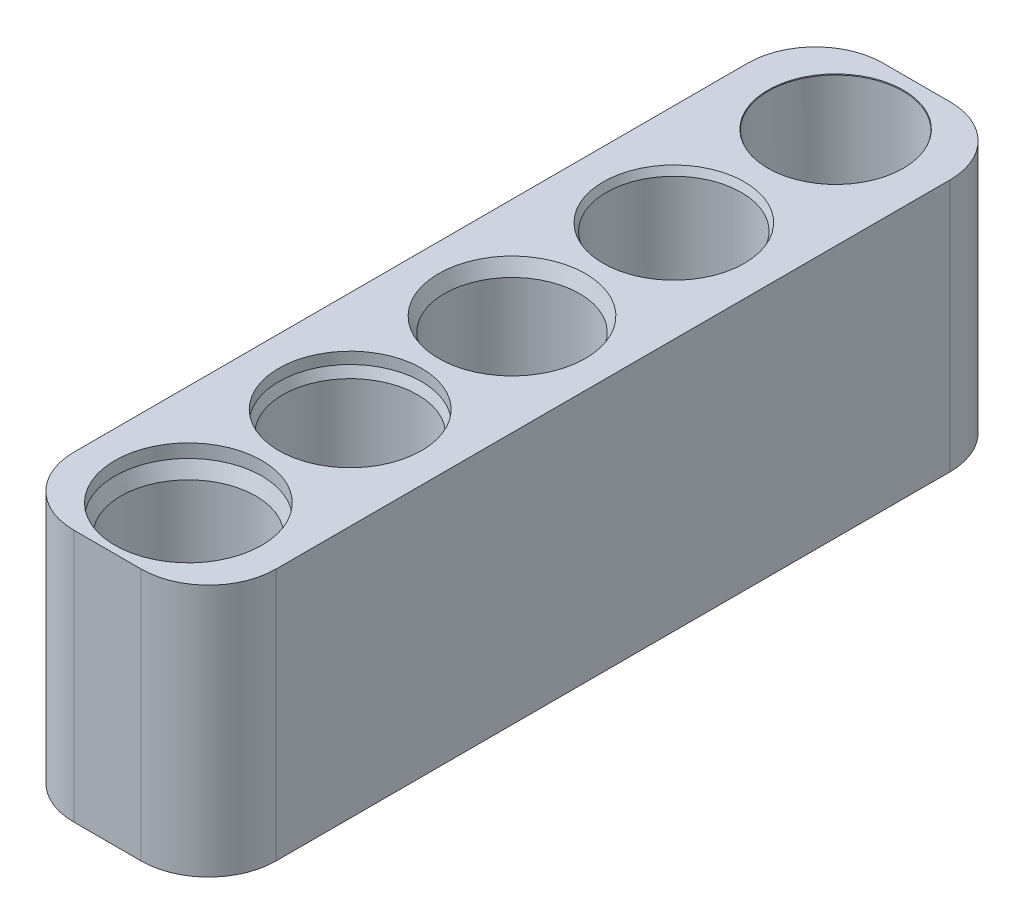
ISO-10303-21;
HEADER;
FILE_DESCRIPTION(('STEP AP214'),'2;1');
FILE_NAME('part.step','',(''),(''),'','','');
FILE_SCHEMA(('AUTOMOTIVE_DESIGN { 1 0 10303 214 1 1 1 1 }'));
ENDSEC;
DATA;
#1=APPLICATION_CONTEXT('core data for automotive mechanical design processes');
#2=APPLICATION_PROTOCOL_DEFINITION('international standard','automotive_design',2000,#1);
#3=PRODUCT_CONTEXT('',#1,'mechanical');
#4=PRODUCT('Part','Part','',(#3));
#5=PRODUCT_RELATED_PRODUCT_CATEGORY('part','',(#4));
#6=PRODUCT_DEFINITION_FORMATION('','',#4);
#7=PRODUCT_DEFINITION_CONTEXT('part definition',#1,'design');
#8=PRODUCT_DEFINITION('design','',#6,#7);
#9=PRODUCT_DEFINITION_SHAPE('','',#8);
#10=(LENGTH_UNIT() NAMED_UNIT(*) SI_UNIT(.MILLI.,.METRE.));
#11=(NAMED_UNIT(*) PLANE_ANGLE_UNIT() SI_UNIT($,.RADIAN.));
#12=(NAMED_UNIT(*) SI_UNIT($,.STERADIAN.) SOLID_ANGLE_UNIT());
#13=UNCERTAINTY_MEASURE_WITH_UNIT(LENGTH_MEASURE(1.E-05),#10,'distance_accuracy_value','');
#14=(GEOMETRIC_REPRESENTATION_CONTEXT(3) GLOBAL_UNCERTAINTY_ASSIGNED_CONTEXT((#13)) GLOBAL_UNIT_ASSIGNED_CONTEXT((#10,
#11,#12)) REPRESENTATION_CONTEXT('',''));
#15=CARTESIAN_POINT('',(0.,0.,0.));
#16=DIRECTION('',(0.,0.,1.));
#17=DIRECTION('',(1.,0.,0.));
#18=AXIS2_PLACEMENT_3D('',#15,#16,#17);
#19=CARTESIAN_POINT('',(-15.,3.,60.));
#20=DIRECTION('',(1.,0.,0.));
#21=DIRECTION('',(0.,1.,0.));
#22=AXIS2_PLACEMENT_3D('',#19,#20,#21);
#23=PLANE('',#22);
#24=DIRECTION('',(0.,0.,-1.));
#25=VECTOR('',#24,1.);
#26=CARTESIAN_POINT('',(-15.,3.,60.));
#27=LINE('',#26,#25);
#28=CARTESIAN_POINT('',(-15.,3.,50.));
#29=VERTEX_POINT('',#28);
#30=CARTESIAN_POINT('',(-15.,3.,-50.));
#31=VERTEX_POINT('',#30);
#32=EDGE_CURVE('E151',#29,#31,#27,.T.);
#33=ORIENTED_EDGE('',*,*,#32,.F.);
#34=DIRECTION('',(0.,-1.,0.));
#35=VECTOR('',#34,1.);
#36=CARTESIAN_POINT('',(-15.,3.,50.));
#37=LINE('',#36,#35);
#38=CARTESIAN_POINT('',(-15.,40.5,50.));
#39=VERTEX_POINT('',#38);
#40=EDGE_CURVE('E113',#29,#39,#37,.F.);
#41=ORIENTED_EDGE('',*,*,#40,.T.);
#42=DIRECTION('',(0.,0.,-1.));
#43=VECTOR('',#42,1.);
#44=CARTESIAN_POINT('',(-15.,40.5,60.));
#45=LINE('',#44,#43);
#46=CARTESIAN_POINT('',(-15.,40.5,-50.));
#47=VERTEX_POINT('',#46);
#48=EDGE_CURVE('E138',#39,#47,#45,.T.);
#49=ORIENTED_EDGE('',*,*,#48,.T.);
#50=DIRECTION('',(0.,-1.,0.));
#51=VECTOR('',#50,1.);
#52=CARTESIAN_POINT('',(-15.,3.,-50.));
#53=LINE('',#52,#51);
#54=EDGE_CURVE('E118',#47,#31,#53,.T.);
#55=ORIENTED_EDGE('',*,*,#54,.T.);
#56=EDGE_LOOP('',(#33,#41,#49,#55));
#57=FACE_BOUND('',#56,.T.);
#58=ADVANCED_FACE('F42',(#57),#23,.F.);
#59=CARTESIAN_POINT('',(-15.,3.,60.));
#60=DIRECTION('',(0.,1.,0.));
#61=DIRECTION('',(-1.,0.,0.));
#62=AXIS2_PLACEMENT_3D('',#59,#60,#61);
#63=PLANE('',#62);
#64=CARTESIAN_POINT('',(0.,3.,48.));
#65=DIRECTION('',(0.,1.,0.));
#66=DIRECTION('',(-1.,0.,0.));
#67=AXIS2_PLACEMENT_3D('',#64,#65,#66);
#68=CIRCLE('',#67,4.16347172712618);
#69=CARTESIAN_POINT('',(-4.16347172712618,3.,48.));
#70=VERTEX_POINT('',#69);
#71=EDGE_CURVE('E178',#70,#70,#68,.T.);
#72=ORIENTED_EDGE('',*,*,#71,.T.);
#73=EDGE_LOOP('',(#72));
#74=FACE_BOUND('',#73,.T.);
#75=CARTESIAN_POINT('',(0.,3.,-24.));
#76=DIRECTION('',(0.,1.,0.));
#77=DIRECTION('',(-1.,0.,0.));
#78=AXIS2_PLACEMENT_3D('',#75,#76,#77);
#79=CIRCLE('',#78,1.66666666666667);
#80=CARTESIAN_POINT('',(0.,3.,-22.3333333333333));
#81=VERTEX_POINT('',#80);
#82=EDGE_CURVE('E175',#81,#81,#79,.T.);
#83=ORIENTED_EDGE('',*,*,#82,.T.);
#84=EDGE_LOOP('',(#83));
#85=FACE_BOUND('',#84,.T.);
#86=CARTESIAN_POINT('',(0.,3.,-48.));
#87=DIRECTION('',(0.,1.,0.));
#88=DIRECTION('',(-1.,0.,0.));
#89=AXIS2_PLACEMENT_3D('',#86,#87,#88);
#90=CIRCLE('',#89,0.833333333333333);
#91=CARTESIAN_POINT('',(0.,3.,-47.1666666666667));
#92=VERTEX_POINT('',#91);
#93=EDGE_CURVE('E172',#92,#92,#90,.T.);
#94=ORIENTED_EDGE('',*,*,#93,.T.);
#95=EDGE_LOOP('',(#94));
#96=FACE_BOUND('',#95,.T.);
#97=CARTESIAN_POINT('',(0.,3.,24.));
#98=DIRECTION('',(0.,1.,0.));
#99=DIRECTION('',(-1.,0.,0.));
#100=AXIS2_PLACEMENT_3D('',#97,#98,#99);
#101=CIRCLE('',#100,3.33173586356309);
#102=CARTESIAN_POINT('',(0.,3.,27.3317358635631));
#103=VERTEX_POINT('',#102);
#104=EDGE_CURVE('E169',#103,#103,#101,.T.);
#105=ORIENTED_EDGE('',*,*,#104,.T.);
#106=EDGE_LOOP('',(#105));
#107=FACE_BOUND('',#106,.T.);
#108=CARTESIAN_POINT('',(0.,3.,0.));
#109=DIRECTION('',(0.,1.,0.));
#110=DIRECTION('',(-1.,0.,0.));
#111=AXIS2_PLACEMENT_3D('',#108,#109,#110);
#112=CIRCLE('',#111,2.5);
#113=CARTESIAN_POINT('',(0.,3.,2.5));
#114=VERTEX_POINT('',#113);
#115=EDGE_CURVE('E166',#114,#114,#112,.T.);
#116=ORIENTED_EDGE('',*,*,#115,.T.);
#117=EDGE_LOOP('',(#116));
#118=FACE_BOUND('',#117,.T.);
#119=DIRECTION('',(1.,0.,0.));
#120=VECTOR('',#119,1.);
#121=CARTESIAN_POINT('',(-15.,3.,60.));
#122=LINE('',#121,#120);
#123=CARTESIAN_POINT('',(-4.99999999999999,3.,60.));
#124=VERTEX_POINT('',#123);
#125=CARTESIAN_POINT('',(5.,3.,60.));
#126=VERTEX_POINT('',#125);
#127=EDGE_CURVE('E126',#124,#126,#122,.T.);
#128=ORIENTED_EDGE('',*,*,#127,.F.);
#129=CARTESIAN_POINT('',(-4.99999999999999,3.,50.));
#130=DIRECTION('',(0.,1.,0.));
#131=DIRECTION('',(-1.,0.,0.));
#132=AXIS2_PLACEMENT_3D('',#129,#130,#131);
#133=CIRCLE('',#132,10.);
#134=EDGE_CURVE('E108',#124,#29,#133,.F.);
#135=ORIENTED_EDGE('',*,*,#134,.T.);
#136=ORIENTED_EDGE('',*,*,#32,.T.);
#137=CARTESIAN_POINT('',(-4.99999999999999,3.,-50.));
#138=DIRECTION('',(0.,1.,0.));
#139=DIRECTION('',(-1.,0.,0.));
#140=AXIS2_PLACEMENT_3D('',#137,#138,#139);
#141=CIRCLE('',#140,10.);
#142=CARTESIAN_POINT('',(-4.99999999999999,3.,-60.));
#143=VERTEX_POINT('',#142);
#144=EDGE_CURVE('E119',#31,#143,#141,.F.);
#145=ORIENTED_EDGE('',*,*,#144,.T.);
#146=DIRECTION('',(1.,0.,0.));
#147=VECTOR('',#146,1.);
#148=CARTESIAN_POINT('',(-15.,3.,-60.));
#149=LINE('',#148,#147);
#150=CARTESIAN_POINT('',(5.,3.,-60.));
#151=VERTEX_POINT('',#150);
#152=EDGE_CURVE('E140',#143,#151,#149,.T.);
#153=ORIENTED_EDGE('',*,*,#152,.T.);
#154=CARTESIAN_POINT('',(5.,3.,-50.));
#155=DIRECTION('',(0.,1.,0.));
#156=DIRECTION('',(-1.,0.,0.));
#157=AXIS2_PLACEMENT_3D('',#154,#155,#156);
#158=CIRCLE('',#157,10.);
#159=CARTESIAN_POINT('',(15.,3.,-50.));
#160=VERTEX_POINT('',#159);
#161=EDGE_CURVE('E183',#151,#160,#158,.F.);
#162=ORIENTED_EDGE('',*,*,#161,.T.);
#163=DIRECTION('',(0.,0.,-1.));
#164=VECTOR('',#163,1.);
#165=CARTESIAN_POINT('',(15.,3.,60.));
#166=LINE('',#165,#164);
#167=CARTESIAN_POINT('',(15.,3.,50.));
#168=VERTEX_POINT('',#167);
#169=EDGE_CURVE('E148',#168,#160,#166,.T.);
#170=ORIENTED_EDGE('',*,*,#169,.F.);
#171=CARTESIAN_POINT('',(5.,3.,50.));
#172=DIRECTION('',(0.,1.,0.));
#173=DIRECTION('',(-1.,0.,0.));
#174=AXIS2_PLACEMENT_3D('',#171,#172,#173);
#175=CIRCLE('',#174,10.);
#176=EDGE_CURVE('E130',#168,#126,#175,.F.);
#177=ORIENTED_EDGE('',*,*,#176,.T.);
#178=EDGE_LOOP('',(#128,#135,#136,#145,#153,#162,#170,#177));
#179=FACE_BOUND('',#178,.T.);
#180=ADVANCED_FACE('F133',(#74,#85,#96,#107,#118,#179),#63,.F.);
#181=CARTESIAN_POINT('',(15.,3.,60.));
#182=DIRECTION('',(-1.,0.,0.));
#183=DIRECTION('',(0.,-1.,0.));
#184=AXIS2_PLACEMENT_3D('',#181,#182,#183);
#185=PLANE('',#184);
#186=ORIENTED_EDGE('',*,*,#169,.T.);
#187=DIRECTION('',(0.,1.,0.));
#188=VECTOR('',#187,1.);
#189=CARTESIAN_POINT('',(15.,40.5,-50.));
#190=LINE('',#189,#188);
#191=CARTESIAN_POINT('',(15.,40.5,-50.));
#192=VERTEX_POINT('',#191);
#193=EDGE_CURVE('E11',#160,#192,#190,.T.);
#194=ORIENTED_EDGE('',*,*,#193,.T.);
#195=DIRECTION('',(0.,0.,-1.));
#196=VECTOR('',#195,1.);
#197=CARTESIAN_POINT('',(15.,40.5,60.));
#198=LINE('',#197,#196);
#199=CARTESIAN_POINT('',(15.,40.5,50.));
#200=VERTEX_POINT('',#199);
#201=EDGE_CURVE('E146',#200,#192,#198,.T.);
#202=ORIENTED_EDGE('',*,*,#201,.F.);
#203=DIRECTION('',(0.,1.,0.));
#204=VECTOR('',#203,1.);
#205=CARTESIAN_POINT('',(15.,3.,50.));
#206=LINE('',#205,#204);
#207=EDGE_CURVE('E50',#200,#168,#206,.F.);
#208=ORIENTED_EDGE('',*,*,#207,.T.);
#209=EDGE_LOOP('',(#186,#194,#202,#208));
#210=FACE_BOUND('',#209,.T.);
#211=ADVANCED_FACE('F201',(#210),#185,.F.);
#212=CARTESIAN_POINT('',(-15.,40.5,60.));
#213=DIRECTION('',(0.,-1.,0.));
#214=DIRECTION('',(1.,0.,0.));
#215=AXIS2_PLACEMENT_3D('',#212,#213,#214);
#216=PLANE('',#215);
#217=CARTESIAN_POINT('',(0.,40.5,48.));
#218=DIRECTION('',(0.,-1.,0.));
#219=DIRECTION('',(1.,0.,0.));
#220=AXIS2_PLACEMENT_3D('',#217,#218,#219);
#221=CIRCLE('',#220,10.9);
#222=CARTESIAN_POINT('',(10.9,40.5,48.));
#223=VERTEX_POINT('',#222);
#224=EDGE_CURVE('E163',#223,#223,#221,.F.);
#225=ORIENTED_EDGE('',*,*,#224,.F.);
#226=EDGE_LOOP('',(#225));
#227=FACE_BOUND('',#226,.T.);
#228=CARTESIAN_POINT('',(0.,40.5,-24.));
#229=DIRECTION('',(0.,-1.,0.));
#230=DIRECTION('',(1.,0.,0.));
#231=AXIS2_PLACEMENT_3D('',#228,#229,#230);
#232=CIRCLE('',#231,10.4739130434783);
#233=CARTESIAN_POINT('',(10.4739130434783,40.5,-24.));
#234=VERTEX_POINT('',#233);
#235=EDGE_CURVE('E160',#234,#234,#232,.F.);
#236=ORIENTED_EDGE('',*,*,#235,.F.);
#237=EDGE_LOOP('',(#236));
#238=FACE_BOUND('',#237,.T.);
#239=CARTESIAN_POINT('',(0.,40.5,-48.));
#240=DIRECTION('',(0.,-1.,0.));
#241=DIRECTION('',(1.,0.,0.));
#242=AXIS2_PLACEMENT_3D('',#239,#240,#241);
#243=CIRCLE('',#242,10.0478260869565);
#244=CARTESIAN_POINT('',(10.0478260869565,40.5,-48.));
#245=VERTEX_POINT('',#244);
#246=EDGE_CURVE('E156',#245,#245,#243,.F.);
#247=ORIENTED_EDGE('',*,*,#246,.F.);
#248=EDGE_LOOP('',(#247));
#249=FACE_BOUND('',#248,.T.);
#250=CARTESIAN_POINT('',(0.,40.5,24.));
#251=DIRECTION('',(0.,-1.,0.));
#252=DIRECTION('',(1.,0.,0.));
#253=AXIS2_PLACEMENT_3D('',#250,#251,#252);
#254=CIRCLE('',#253,10.5926916677333);
#255=CARTESIAN_POINT('',(10.5926916677333,40.5,24.));
#256=VERTEX_POINT('',#255);
#257=EDGE_CURVE('E153',#256,#256,#254,.F.);
#258=ORIENTED_EDGE('',*,*,#257,.F.);
#259=EDGE_LOOP('',(#258));
#260=FACE_BOUND('',#259,.T.);
#261=CARTESIAN_POINT('',(0.,40.5,0.));
#262=DIRECTION('',(0.,-1.,0.));
#263=DIRECTION('',(0.,0.,-1.));
#264=AXIS2_PLACEMENT_3D('',#261,#262,#263);
#265=CIRCLE('',#264,10.9);
#266=CARTESIAN_POINT('',(0.,40.5,-10.9));
#267=VERTEX_POINT('',#266);
#268=EDGE_CURVE('E221',#267,#267,#265,.T.);
#269=ORIENTED_EDGE('',*,*,#268,.T.);
#270=EDGE_LOOP('',(#269));
#271=FACE_BOUND('',#270,.T.);
#272=ORIENTED_EDGE('',*,*,#48,.F.);
#273=CARTESIAN_POINT('',(-5.,40.5,50.));
#274=DIRECTION('',(0.,-1.,0.));
#275=DIRECTION('',(1.,0.,0.));
#276=AXIS2_PLACEMENT_3D('',#273,#274,#275);
#277=CIRCLE('',#276,10.);
#278=CARTESIAN_POINT('',(-5.,40.5,60.));
#279=VERTEX_POINT('',#278);
#280=EDGE_CURVE('E194',#39,#279,#277,.F.);
#281=ORIENTED_EDGE('',*,*,#280,.T.);
#282=DIRECTION('',(-1.,0.,0.));
#283=VECTOR('',#282,1.);
#284=CARTESIAN_POINT('',(-15.,40.5,60.));
#285=LINE('',#284,#283);
#286=CARTESIAN_POINT('',(5.00000000000001,40.5,60.));
#287=VERTEX_POINT('',#286);
#288=EDGE_CURVE('E129',#287,#279,#285,.T.);
#289=ORIENTED_EDGE('',*,*,#288,.F.);
#290=CARTESIAN_POINT('',(5.00000000000001,40.5,50.));
#291=DIRECTION('',(0.,-1.,0.));
#292=DIRECTION('',(1.,0.,0.));
#293=AXIS2_PLACEMENT_3D('',#290,#291,#292);
#294=CIRCLE('',#293,10.);
#295=EDGE_CURVE('E189',#287,#200,#294,.F.);
#296=ORIENTED_EDGE('',*,*,#295,.T.);
#297=ORIENTED_EDGE('',*,*,#201,.T.);
#298=CARTESIAN_POINT('',(5.00000000000001,40.5,-50.));
#299=DIRECTION('',(0.,-1.,0.));
#300=DIRECTION('',(1.,0.,0.));
#301=AXIS2_PLACEMENT_3D('',#298,#299,#300);
#302=CIRCLE('',#301,10.);
#303=CARTESIAN_POINT('',(5.00000000000001,40.5,-60.));
#304=VERTEX_POINT('',#303);
#305=EDGE_CURVE('E64',#192,#304,#302,.F.);
#306=ORIENTED_EDGE('',*,*,#305,.T.);
#307=DIRECTION('',(-1.,0.,0.));
#308=VECTOR('',#307,1.);
#309=CARTESIAN_POINT('',(-15.,40.5,-60.));
#310=LINE('',#309,#308);
#311=CARTESIAN_POINT('',(-5.,40.5,-60.));
#312=VERTEX_POINT('',#311);
#313=EDGE_CURVE('E136',#304,#312,#310,.T.);
#314=ORIENTED_EDGE('',*,*,#313,.T.);
#315=CARTESIAN_POINT('',(-5.,40.5,-50.));
#316=DIRECTION('',(0.,-1.,0.));
#317=DIRECTION('',(1.,0.,0.));
#318=AXIS2_PLACEMENT_3D('',#315,#316,#317);
#319=CIRCLE('',#318,10.);
#320=EDGE_CURVE('E192',#312,#47,#319,.F.);
#321=ORIENTED_EDGE('',*,*,#320,.T.);
#322=EDGE_LOOP('',(#272,#281,#289,#296,#297,#306,#314,#321));
#323=FACE_BOUND('',#322,.T.);
#324=ADVANCED_FACE('F207',(#227,#238,#249,#260,#271,#323),#216,.F.);
#325=CARTESIAN_POINT('',(0.,0.,60.));
#326=DIRECTION('',(0.,0.,-1.));
#327=DIRECTION('',(-1.,0.,0.));
#328=AXIS2_PLACEMENT_3D('',#325,#326,#327);
#329=PLANE('',#328);
#330=ORIENTED_EDGE('',*,*,#288,.T.);
#331=DIRECTION('',(0.,-1.,0.));
#332=VECTOR('',#331,1.);
#333=CARTESIAN_POINT('',(-4.99999999999999,0.,60.));
#334=LINE('',#333,#332);
#335=EDGE_CURVE('E112',#279,#124,#334,.T.);
#336=ORIENTED_EDGE('',*,*,#335,.T.);
#337=ORIENTED_EDGE('',*,*,#127,.T.);
#338=DIRECTION('',(0.,1.,0.));
#339=VECTOR('',#338,1.);
#340=CARTESIAN_POINT('',(5.,0.,60.));
#341=LINE('',#340,#339);
#342=EDGE_CURVE('E131',#126,#287,#341,.T.);
#343=ORIENTED_EDGE('',*,*,#342,.T.);
#344=EDGE_LOOP('',(#330,#336,#337,#343));
#345=FACE_BOUND('',#344,.T.);
#346=ADVANCED_FACE('F124',(#345),#329,.F.);
#347=CARTESIAN_POINT('',(0.,0.,-60.));
#348=DIRECTION('',(0.,0.,-1.));
#349=DIRECTION('',(-1.,0.,0.));
#350=AXIS2_PLACEMENT_3D('',#347,#348,#349);
#351=PLANE('',#350);
#352=ORIENTED_EDGE('',*,*,#152,.F.);
#353=DIRECTION('',(0.,-1.,0.));
#354=VECTOR('',#353,1.);
#355=CARTESIAN_POINT('',(-5.,40.5,-60.));
#356=LINE('',#355,#354);
#357=EDGE_CURVE('E57',#143,#312,#356,.F.);
#358=ORIENTED_EDGE('',*,*,#357,.T.);
#359=ORIENTED_EDGE('',*,*,#313,.F.);
#360=DIRECTION('',(0.,1.,0.));
#361=VECTOR('',#360,1.);
#362=CARTESIAN_POINT('',(5.,3.,-60.));
#363=LINE('',#362,#361);
#364=EDGE_CURVE('E196',#304,#151,#363,.F.);
#365=ORIENTED_EDGE('',*,*,#364,.T.);
#366=EDGE_LOOP('',(#352,#358,#359,#365));
#367=FACE_BOUND('',#366,.T.);
#368=ADVANCED_FACE('F213',(#367),#351,.T.);
#369=CARTESIAN_POINT('',(0.,0.,0.));
#370=DIRECTION('',(0.,1.,0.));
#371=DIRECTION('',(0.,0.,1.));
#372=AXIS2_PLACEMENT_3D('',#369,#370,#371);
#373=CONICAL_SURFACE('',#372,0.,0.694738276196703);
#374=CARTESIAN_POINT('',(0.,12.,0.));
#375=DIRECTION('',(0.,-1.,0.));
#376=DIRECTION('',(0.,0.,-1.));
#377=AXIS2_PLACEMENT_3D('',#374,#375,#376);
#378=CIRCLE('',#377,10.);
#379=CARTESIAN_POINT('',(0.,12.,10.));
#380=VERTEX_POINT('',#379);
#381=EDGE_CURVE('E157',#380,#380,#378,.T.);
#382=CARTESIAN_POINT('',(0.,12.,10.));
#383=CARTESIAN_POINT('',(0.,11.90625,9.921875));
#384=CARTESIAN_POINT('',(0.,11.8125,9.84375));
#385=CARTESIAN_POINT('',(0.,11.625,9.6875));
#386=CARTESIAN_POINT('',(0.,11.53125,9.609375));
#387=CARTESIAN_POINT('',(0.,11.34375,9.453125));
#388=CARTESIAN_POINT('',(0.,11.25,9.375));
#389=CARTESIAN_POINT('',(0.,11.0625,9.21875));
#390=CARTESIAN_POINT('',(0.,10.96875,9.140625));
#391=CARTESIAN_POINT('',(0.,10.78125,8.984375));
#392=CARTESIAN_POINT('',(0.,10.6875,8.90625));
#393=CARTESIAN_POINT('',(0.,10.5,8.75));
#394=CARTESIAN_POINT('',(0.,10.40625,8.671875));
#395=CARTESIAN_POINT('',(0.,10.21875,8.515625));
#396=CARTESIAN_POINT('',(0.,10.125,8.4375));
#397=CARTESIAN_POINT('',(0.,9.9375,8.28125));
#398=CARTESIAN_POINT('',(0.,9.84375,8.203125));
#399=CARTESIAN_POINT('',(0.,9.65625,8.046875));
#400=CARTESIAN_POINT('',(0.,9.5625,7.96875));
#401=CARTESIAN_POINT('',(0.,9.375,7.8125));
#402=CARTESIAN_POINT('',(0.,9.28125,7.734375));
#403=CARTESIAN_POINT('',(0.,9.09375,7.578125));
#404=CARTESIAN_POINT('',(0.,9.00000000000001,7.5));
#405=CARTESIAN_POINT('',(0.,8.8125,7.34375));
#406=CARTESIAN_POINT('',(0.,8.71875,7.265625));
#407=CARTESIAN_POINT('',(0.,8.53125,7.109375));
#408=CARTESIAN_POINT('',(0.,8.4375,7.03125));
#409=CARTESIAN_POINT('',(0.,8.25,6.875));
#410=CARTESIAN_POINT('',(0.,8.15625,6.796875));
#411=CARTESIAN_POINT('',(0.,7.96875,6.640625));
#412=CARTESIAN_POINT('',(0.,7.875,6.5625));
#413=CARTESIAN_POINT('',(0.,7.6875,6.40625));
#414=CARTESIAN_POINT('',(0.,7.59375,6.328125));
#415=CARTESIAN_POINT('',(0.,7.40625,6.171875));
#416=CARTESIAN_POINT('',(0.,7.3125,6.09375));
#417=CARTESIAN_POINT('',(0.,7.125,5.9375));
#418=CARTESIAN_POINT('',(0.,7.03125,5.859375));
#419=CARTESIAN_POINT('',(0.,6.84375,5.703125));
#420=CARTESIAN_POINT('',(0.,6.75,5.625));
#421=CARTESIAN_POINT('',(0.,6.5625,5.46875));
#422=CARTESIAN_POINT('',(0.,6.46875,5.390625));
#423=CARTESIAN_POINT('',(0.,6.28125,5.234375));
#424=CARTESIAN_POINT('',(0.,6.1875,5.15625));
#425=CARTESIAN_POINT('',(0.,6.,5.));
#426=CARTESIAN_POINT('',(0.,5.90625,4.921875));
#427=CARTESIAN_POINT('',(0.,5.71875,4.765625));
#428=CARTESIAN_POINT('',(0.,5.625,4.6875));
#429=CARTESIAN_POINT('',(0.,5.4375,4.53125));
#430=CARTESIAN_POINT('',(0.,5.34375,4.453125));
#431=CARTESIAN_POINT('',(0.,5.15625,4.296875));
#432=CARTESIAN_POINT('',(0.,5.0625,4.21875));
#433=CARTESIAN_POINT('',(0.,4.875,4.0625));
#434=CARTESIAN_POINT('',(0.,4.78125,3.984375));
#435=CARTESIAN_POINT('',(0.,4.59375,3.828125));
#436=CARTESIAN_POINT('',(0.,4.5,3.75));
#437=CARTESIAN_POINT('',(0.,4.3125,3.59375));
#438=CARTESIAN_POINT('',(0.,4.21875,3.515625));
#439=CARTESIAN_POINT('',(0.,4.03125,3.359375));
#440=CARTESIAN_POINT('',(0.,3.9375,3.28125));
#441=CARTESIAN_POINT('',(0.,3.75,3.125));
#442=CARTESIAN_POINT('',(0.,3.65625,3.046875));
#443=CARTESIAN_POINT('',(0.,3.46875,2.890625));
#444=CARTESIAN_POINT('',(0.,3.375,2.8125));
#445=CARTESIAN_POINT('',(0.,3.1875,2.65625));
#446=CARTESIAN_POINT('',(0.,3.09375,2.578125));
#447=CARTESIAN_POINT('',(0.,3.,2.5));
#448=B_SPLINE_CURVE_WITH_KNOTS('',3,(#382,#383,#384,#385,#386,#387,#388,#389,#390,#391,#392,
#393,#394,#395,#396,#397,#398,#399,#400,#401,#402,#403,#404,#405,#406,#407,#408,#409,#410,#411,
#412,#413,#414,#415,#416,#417,#418,#419,#420,#421,#422,#423,#424,#425,#426,#427,#428,#429,#430,
#431,#432,#433,#434,#435,#436,#437,#438,#439,#440,#441,#442,#443,#444,#445,#446,#447),
.UNSPECIFIED.,.F.,.F.,(4,2,2,2,2,2,2,2,2,2,2,2,2,2,2,2,2,2,2,2,2,2,2,2,2,2,2,2,2,2,2,2,4),(0.,
0.366105453558125,0.732210907116249,1.09831636067437,1.4644218142325,1.83052726779062,
2.19663272134875,2.56273817490687,2.928843628465,3.29494908202312,3.66105453558125,
4.02715998913937,4.39326544269749,4.75937089625562,5.12547634981374,5.49158180337187,
5.85768725692999,6.22379271048811,6.58989816404624,6.95600361760436,7.32210907116249,
7.68821452472061,8.05431997827873,8.42042543183686,8.78653088539498,9.15263633895311,
9.51874179251123,9.88484724606936,10.2509526996275,10.6170581531856,10.9831636067437,
11.3492690603019,11.71537451386),.UNSPECIFIED.);
#449=EDGE_CURVE('BSEAM280',#380,#114,#448,.T.);
#450=ORIENTED_EDGE('',*,*,#381,.F.);
#451=ORIENTED_EDGE('',*,*,#115,.F.);
#452=ORIENTED_EDGE('',*,*,#449,.T.);
#453=ORIENTED_EDGE('',*,*,#449,.F.);
#454=EDGE_LOOP('',(#450,#452,#451,#453));
#455=FACE_BOUND('',#454,.T.);
#456=ADVANCED_FACE('F280',(#455),#373,.F.);
#457=CARTESIAN_POINT('',(0.,0.,0.));
#458=DIRECTION('',(0.,-1.,0.));
#459=DIRECTION('',(0.,0.,-1.));
#460=AXIS2_PLACEMENT_3D('',#457,#458,#459);
#461=CYLINDRICAL_SURFACE('',#460,10.);
#462=CARTESIAN_POINT('',(0.,38.3877551020408,0.));
#463=DIRECTION('',(0.,-1.,0.));
#464=DIRECTION('',(0.,0.,-1.));
#465=AXIS2_PLACEMENT_3D('',#462,#463,#464);
#466=CIRCLE('',#465,10.);
#467=CARTESIAN_POINT('',(0.,38.3877551020408,-10.));
#468=VERTEX_POINT('',#467);
#469=EDGE_CURVE('E218',#468,#468,#466,.T.);
#470=ORIENTED_EDGE('',*,*,#469,.F.);
#471=EDGE_LOOP('',(#470));
#472=FACE_BOUND('',#471,.T.);
#473=ORIENTED_EDGE('',*,*,#381,.T.);
#474=EDGE_LOOP('',(#473));
#475=FACE_BOUND('',#474,.T.);
#476=ADVANCED_FACE('F282',(#472,#475),#461,.F.);
#477=CARTESIAN_POINT('',(0.,40.5,0.));
#478=DIRECTION('',(0.,1.,0.));
#479=DIRECTION('',(0.,0.,1.));
#480=AXIS2_PLACEMENT_3D('',#477,#478,#479);
#481=CONICAL_SURFACE('',#480,10.9,0.402790949039647);
#482=ORIENTED_EDGE('',*,*,#469,.T.);
#483=EDGE_LOOP('',(#482));
#484=FACE_BOUND('',#483,.T.);
#485=ORIENTED_EDGE('',*,*,#268,.F.);
#486=EDGE_LOOP('',(#485));
#487=FACE_BOUND('',#486,.T.);
#488=ADVANCED_FACE('F289',(#484,#487),#481,.F.);
#489=CARTESIAN_POINT('',(0.,-0.998083036275707,24.));
#490=DIRECTION('',(0.,1.,0.));
#491=DIRECTION('',(0.,0.,1.));
#492=AXIS2_PLACEMENT_3D('',#489,#490,#491);
#493=CONICAL_SURFACE('',#492,0.,0.694738276196703);
#494=CARTESIAN_POINT('',(0.,11.0019169637243,24.));
#495=DIRECTION('',(0.,-1.,0.));
#496=DIRECTION('',(0.,0.,-1.));
#497=AXIS2_PLACEMENT_3D('',#494,#495,#496);
#498=CIRCLE('',#497,10.);
#499=CARTESIAN_POINT('',(0.,11.0019169637243,34.));
#500=VERTEX_POINT('',#499);
#501=EDGE_CURVE('E240',#500,#500,#498,.T.);
#502=CARTESIAN_POINT('',(0.,11.0019169637243,34.));
#503=CARTESIAN_POINT('',(0.,10.9185636620188,33.9305389152454));
#504=CARTESIAN_POINT('',(0.,10.8352103603134,33.8610778304909));
#505=CARTESIAN_POINT('',(0.,10.6685037569025,33.7221556609818));
#506=CARTESIAN_POINT('',(0.,10.585150455197,33.6526945762272));
#507=CARTESIAN_POINT('',(0.,10.4184438517861,33.5137724067181));
#508=CARTESIAN_POINT('',(0.,10.3350905500806,33.4443113219636));
#509=CARTESIAN_POINT('',(0.,10.1683839466697,33.3053891524545));
#510=CARTESIAN_POINT('',(0.,10.0850306449642,33.2359280676999));
#511=CARTESIAN_POINT('',(0.,9.9183240415533,33.0970058981908));
#512=CARTESIAN_POINT('',(0.,9.83497073984784,33.0275448134363));
#513=CARTESIAN_POINT('',(0.,9.66826413643691,32.8886226439272));
#514=CARTESIAN_POINT('',(0.,9.58491083473145,32.8191615591726));
#515=CARTESIAN_POINT('',(0.,9.41820423132053,32.6802393896635));
#516=CARTESIAN_POINT('',(0.,9.33485092961507,32.610778304909));
#517=CARTESIAN_POINT('',(0.,9.16814432620415,32.4718561353999));
#518=CARTESIAN_POINT('',(0.,9.08479102449868,32.4023950506453));
#519=CARTESIAN_POINT('',(0.,8.91808442108776,32.2634728811362));
#520=CARTESIAN_POINT('',(0.,8.8347311193823,32.1940117963817));
#521=CARTESIAN_POINT('',(0.,8.66802451597138,32.0550896268726));
#522=CARTESIAN_POINT('',(0.,8.58467121426592,31.985628542118));
#523=CARTESIAN_POINT('',(0.,8.41796461085499,31.8467063726089));
#524=CARTESIAN_POINT('',(0.,8.33461130914953,31.7772452878544));
#525=CARTESIAN_POINT('',(0.,8.16790470573861,31.6383231183453));
#526=CARTESIAN_POINT('',(0.,8.08455140403315,31.5688620335907));
#527=CARTESIAN_POINT('',(0.,7.91784480062223,31.4299398640816));
#528=CARTESIAN_POINT('',(0.,7.83449149891676,31.3604787793271));
#529=CARTESIAN_POINT('',(0.,7.66778489550584,31.221556609818));
#530=CARTESIAN_POINT('',(0.,7.58443159380038,31.1520955250634));
#531=CARTESIAN_POINT('',(0.,7.41772499038946,31.0131733555543));
#532=CARTESIAN_POINT('',(0.,7.334371688684,30.9437122707998));
#533=CARTESIAN_POINT('',(0.,7.16766508527307,30.8047901012906));
#534=CARTESIAN_POINT('',(0.,7.08431178356761,30.7353290165361));
#535=CARTESIAN_POINT('',(0.,6.91760518015669,30.596406847027));
#536=CARTESIAN_POINT('',(0.,6.83425187845123,30.5269457622724));
#537=CARTESIAN_POINT('',(0.,6.6675452750403,30.3880235927633));
#538=CARTESIAN_POINT('',(0.,6.58419197333484,30.3185625080088));
#539=CARTESIAN_POINT('',(0.,6.41748536992392,30.1796403384997));
#540=CARTESIAN_POINT('',(0.,6.33413206821846,30.1101792537451));
#541=CARTESIAN_POINT('',(0.,6.16742546480754,29.971257084236));
#542=CARTESIAN_POINT('',(0.,6.08407216310207,29.9017959994815));
#543=CARTESIAN_POINT('',(0.,5.91736555969115,29.7628738299724));
#544=CARTESIAN_POINT('',(0.,5.83401225798569,29.6934127452178));
#545=CARTESIAN_POINT('',(0.,5.66730565457477,29.5544905757087));
#546=CARTESIAN_POINT('',(0.,5.58395235286931,29.4850294909542));
#547=CARTESIAN_POINT('',(0.,5.41724574945838,29.3461073214451));
#548=CARTESIAN_POINT('',(0.,5.33389244775292,29.2766462366905));
#549=CARTESIAN_POINT('',(0.,5.167185844342,29.1377240671814));
#550=CARTESIAN_POINT('',(0.,5.08383254263654,29.0682629824269));
#551=CARTESIAN_POINT('',(0.,4.91712593922561,28.9293408129178));
#552=CARTESIAN_POINT('',(0.,4.83377263752015,28.8598797281632));
#553=CARTESIAN_POINT('',(0.,4.66706603410923,28.7209575586541));
#554=CARTESIAN_POINT('',(0.,4.58371273240377,28.6514964738996));
#555=CARTESIAN_POINT('',(0.,4.41700612899285,28.5125743043905));
#556=CARTESIAN_POINT('',(0.,4.33365282728739,28.4431132196359));
#557=CARTESIAN_POINT('',(0.,4.16694622387646,28.3041910501268));
#558=CARTESIAN_POINT('',(0.,4.083592922171,28.2347299653723));
#559=CARTESIAN_POINT('',(0.,3.91688631876008,28.0958077958632));
#560=CARTESIAN_POINT('',(0.,3.83353301705462,28.0263467111086));
#561=CARTESIAN_POINT('',(0.,3.66682641364369,27.8874245415995));
#562=CARTESIAN_POINT('',(0.,3.58347311193823,27.817963456845));
#563=CARTESIAN_POINT('',(0.,3.41676650852731,27.6790412873358));
#564=CARTESIAN_POINT('',(0.,3.33341320682185,27.6095802025813));
#565=CARTESIAN_POINT('',(0.,3.16670660341093,27.4706580330722));
#566=CARTESIAN_POINT('',(0.,3.08335330170546,27.4011969483176));
#567=CARTESIAN_POINT('',(0.,3.,27.3317358635631));
#568=B_SPLINE_CURVE_WITH_KNOTS('',3,(#502,#503,#504,#505,#506,#507,#508,#509,#510,#511,#512,
#513,#514,#515,#516,#517,#518,#519,#520,#521,#522,#523,#524,#525,#526,#527,#528,#529,#530,#531,
#532,#533,#534,#535,#536,#537,#538,#539,#540,#541,#542,#543,#544,#545,#546,#547,#548,#549,#550,
#551,#552,#553,#554,#555,#556,#557,#558,#559,#560,#561,#562,#563,#564,#565,#566,#567),
.UNSPECIFIED.,.F.,.F.,(4,2,2,2,2,2,2,2,2,2,2,2,2,2,2,2,2,2,2,2,2,2,2,2,2,2,2,2,2,2,2,2,4),(0.,
0.325505048815418,0.651010097630831,0.976515146446245,1.30202019526166,1.62752524407708,
1.95303029289249,2.27853534170791,2.60404039052332,2.92954543933873,3.25505048815415,
3.58055553696956,3.90606058578498,4.23156563460039,4.55707068341581,4.88257573223122,
5.20808078104664,5.53358582986205,5.85909087867747,6.18459592749288,6.5101009763083,
6.83560602512371,7.16111107393912,7.48661612275454,7.81212117156996,8.13762622038537,
8.46313126920078,8.7886363180162,9.11414136683161,9.43964641564703,9.76515146446244,
10.0906565132779,10.4161615620933),.UNSPECIFIED.);
#569=EDGE_CURVE('BSEAM500',#500,#103,#568,.T.);
#570=ORIENTED_EDGE('',*,*,#501,.F.);
#571=ORIENTED_EDGE('',*,*,#104,.F.);
#572=ORIENTED_EDGE('',*,*,#569,.T.);
#573=ORIENTED_EDGE('',*,*,#569,.F.);
#574=EDGE_LOOP('',(#570,#572,#571,#573));
#575=FACE_BOUND('',#574,.T.);
#576=ADVANCED_FACE('F500',(#575),#493,.F.);
#577=CARTESIAN_POINT('',(0.,-0.998083036275707,24.));
#578=DIRECTION('',(0.,-1.,0.));
#579=DIRECTION('',(0.,0.,-1.));
#580=AXIS2_PLACEMENT_3D('',#577,#578,#579);
#581=CYLINDRICAL_SURFACE('',#580,10.5926916677333);
#582=CARTESIAN_POINT('',(0.,38.7806831226901,24.));
#583=DIRECTION('',(0.,-1.,0.));
#584=DIRECTION('',(0.,0.,-1.));
#585=AXIS2_PLACEMENT_3D('',#582,#583,#584);
#586=CIRCLE('',#585,10.5926916677333);
#587=CARTESIAN_POINT('',(0.,38.7806831226901,13.4073083322667));
#588=VERTEX_POINT('',#587);
#589=EDGE_CURVE('E247',#588,#588,#586,.T.);
#590=ORIENTED_EDGE('',*,*,#589,.T.);
#591=EDGE_LOOP('',(#590));
#592=FACE_BOUND('',#591,.T.);
#593=ORIENTED_EDGE('',*,*,#257,.T.);
#594=EDGE_LOOP('',(#593));
#595=FACE_BOUND('',#594,.T.);
#596=ADVANCED_FACE('F489',(#592,#595),#581,.F.);
#597=CARTESIAN_POINT('',(0.,-0.998083036275707,24.));
#598=DIRECTION('',(0.,-1.,0.));
#599=DIRECTION('',(0.,0.,-1.));
#600=AXIS2_PLACEMENT_3D('',#597,#598,#599);
#601=CYLINDRICAL_SURFACE('',#600,10.);
#602=CARTESIAN_POINT('',(0.,37.3896720657651,24.));
#603=DIRECTION('',(0.,-1.,0.));
#604=DIRECTION('',(0.,0.,-1.));
#605=AXIS2_PLACEMENT_3D('',#602,#603,#604);
#606=CIRCLE('',#605,10.);
#607=CARTESIAN_POINT('',(0.,37.3896720657651,14.));
#608=VERTEX_POINT('',#607);
#609=EDGE_CURVE('E244',#608,#608,#606,.T.);
#610=ORIENTED_EDGE('',*,*,#609,.F.);
#611=EDGE_LOOP('',(#610));
#612=FACE_BOUND('',#611,.T.);
#613=ORIENTED_EDGE('',*,*,#501,.T.);
#614=EDGE_LOOP('',(#613));
#615=FACE_BOUND('',#614,.T.);
#616=ADVANCED_FACE('F478',(#612,#615),#601,.F.);
#617=CARTESIAN_POINT('',(0.,38.7806831226901,24.));
#618=DIRECTION('',(0.,1.,0.));
#619=DIRECTION('',(0.,0.,1.));
#620=AXIS2_PLACEMENT_3D('',#617,#618,#619);
#621=CONICAL_SURFACE('',#620,10.5926916677333,0.402790949039647);
#622=ORIENTED_EDGE('',*,*,#609,.T.);
#623=EDGE_LOOP('',(#622));
#624=FACE_BOUND('',#623,.T.);
#625=ORIENTED_EDGE('',*,*,#589,.F.);
#626=EDGE_LOOP('',(#625));
#627=FACE_BOUND('',#626,.T.);
#628=ADVANCED_FACE('F268',(#624,#627),#621,.F.);
#629=CARTESIAN_POINT('',(0.,2.,-48.));
#630=DIRECTION('',(0.,1.,0.));
#631=DIRECTION('',(0.,0.,1.));
#632=AXIS2_PLACEMENT_3D('',#629,#630,#631);
#633=CONICAL_SURFACE('',#632,0.,0.694738276196703);
#634=CARTESIAN_POINT('',(0.,14.,-48.));
#635=DIRECTION('',(0.,-1.,0.));
#636=DIRECTION('',(0.,0.,-1.));
#637=AXIS2_PLACEMENT_3D('',#634,#635,#636);
#638=CIRCLE('',#637,9.99999999999999);
#639=CARTESIAN_POINT('',(0.,14.,-38.));
#640=VERTEX_POINT('',#639);
#641=EDGE_CURVE('E232',#640,#640,#638,.T.);
#642=CARTESIAN_POINT('',(0.,14.,-38.));
#643=CARTESIAN_POINT('',(0.,13.8854166666667,-38.0954861111111));
#644=CARTESIAN_POINT('',(0.,13.7708333333333,-38.1909722222222));
#645=CARTESIAN_POINT('',(0.,13.5416666666667,-38.3819444444445));
#646=CARTESIAN_POINT('',(0.,13.4270833333333,-38.4774305555556));
#647=CARTESIAN_POINT('',(0.,13.1979166666667,-38.6684027777778));
#648=CARTESIAN_POINT('',(0.,13.0833333333333,-38.7638888888889));
#649=CARTESIAN_POINT('',(0.,12.8541666666667,-38.9548611111111));
#650=CARTESIAN_POINT('',(0.,12.7395833333333,-39.0503472222222));
#651=CARTESIAN_POINT('',(0.,12.5104166666667,-39.2413194444444));
#652=CARTESIAN_POINT('',(0.,12.3958333333333,-39.3368055555556));
#653=CARTESIAN_POINT('',(0.,12.1666666666667,-39.5277777777778));
#654=CARTESIAN_POINT('',(0.,12.0520833333333,-39.6232638888889));
#655=CARTESIAN_POINT('',(0.,11.8229166666667,-39.8142361111111));
#656=CARTESIAN_POINT('',(0.,11.7083333333333,-39.9097222222222));
#657=CARTESIAN_POINT('',(0.,11.4791666666667,-40.1006944444444));
#658=CARTESIAN_POINT('',(0.,11.3645833333333,-40.1961805555556));
#659=CARTESIAN_POINT('',(0.,11.1354166666667,-40.3871527777778));
#660=CARTESIAN_POINT('',(0.,11.0208333333333,-40.4826388888889));
#661=CARTESIAN_POINT('',(0.,10.7916666666667,-40.6736111111111));
#662=CARTESIAN_POINT('',(0.,10.6770833333333,-40.7690972222222));
#663=CARTESIAN_POINT('',(0.,10.4479166666667,-40.9600694444445));
#664=CARTESIAN_POINT('',(0.,10.3333333333333,-41.0555555555556));
#665=CARTESIAN_POINT('',(0.,10.1041666666667,-41.2465277777778));
#666=CARTESIAN_POINT('',(0.,9.98958333333333,-41.3420138888889));
#667=CARTESIAN_POINT('',(0.,9.76041666666667,-41.5329861111111));
#668=CARTESIAN_POINT('',(0.,9.64583333333334,-41.6284722222222));
#669=CARTESIAN_POINT('',(0.,9.41666666666667,-41.8194444444444));
#670=CARTESIAN_POINT('',(0.,9.30208333333333,-41.9149305555556));
#671=CARTESIAN_POINT('',(0.,9.07291666666667,-42.1059027777778));
#672=CARTESIAN_POINT('',(0.,8.95833333333334,-42.2013888888889));
#673=CARTESIAN_POINT('',(0.,8.72916666666667,-42.3923611111111));
#674=CARTESIAN_POINT('',(0.,8.61458333333333,-42.4878472222222));
#675=CARTESIAN_POINT('',(0.,8.38541666666667,-42.6788194444444));
#676=CARTESIAN_POINT('',(0.,8.27083333333333,-42.7743055555556));
#677=CARTESIAN_POINT('',(0.,8.04166666666667,-42.9652777777778));
#678=CARTESIAN_POINT('',(0.,7.92708333333333,-43.0607638888889));
#679=CARTESIAN_POINT('',(0.,7.69791666666667,-43.2517361111111));
#680=CARTESIAN_POINT('',(0.,7.58333333333334,-43.3472222222222));
#681=CARTESIAN_POINT('',(0.,7.35416666666667,-43.5381944444444));
#682=CARTESIAN_POINT('',(0.,7.23958333333333,-43.6336805555556));
#683=CARTESIAN_POINT('',(0.,7.01041666666667,-43.8246527777778));
#684=CARTESIAN_POINT('',(0.,6.89583333333333,-43.9201388888889));
#685=CARTESIAN_POINT('',(0.,6.66666666666667,-44.1111111111111));
#686=CARTESIAN_POINT('',(0.,6.55208333333334,-44.2065972222222));
#687=CARTESIAN_POINT('',(0.,6.32291666666667,-44.3975694444444));
#688=CARTESIAN_POINT('',(0.,6.20833333333333,-44.4930555555556));
#689=CARTESIAN_POINT('',(0.,5.97916666666667,-44.6840277777778));
#690=CARTESIAN_POINT('',(0.,5.86458333333334,-44.7795138888889));
#691=CARTESIAN_POINT('',(0.,5.63541666666667,-44.9704861111111));
#692=CARTESIAN_POINT('',(0.,5.52083333333333,-45.0659722222222));
#693=CARTESIAN_POINT('',(0.,5.29166666666667,-45.2569444444444));
#694=CARTESIAN_POINT('',(0.,5.17708333333333,-45.3524305555556));
#695=CARTESIAN_POINT('',(0.,4.94791666666667,-45.5434027777778));
#696=CARTESIAN_POINT('',(0.,4.83333333333333,-45.6388888888889));
#697=CARTESIAN_POINT('',(0.,4.60416666666667,-45.8298611111111));
#698=CARTESIAN_POINT('',(0.,4.48958333333334,-45.9253472222222));
#699=CARTESIAN_POINT('',(0.,4.26041666666667,-46.1163194444444));
#700=CARTESIAN_POINT('',(0.,4.14583333333333,-46.2118055555556));
#701=CARTESIAN_POINT('',(0.,3.91666666666667,-46.4027777777778));
#702=CARTESIAN_POINT('',(0.,3.80208333333334,-46.4982638888889));
#703=CARTESIAN_POINT('',(0.,3.57291666666667,-46.6892361111111));
#704=CARTESIAN_POINT('',(0.,3.45833333333334,-46.7847222222222));
#705=CARTESIAN_POINT('',(0.,3.22916666666667,-46.9756944444444));
#706=CARTESIAN_POINT('',(0.,3.11458333333333,-47.0711805555556));
#707=CARTESIAN_POINT('',(0.,3.,-47.1666666666667));
#708=B_SPLINE_CURVE_WITH_KNOTS('',3,(#642,#643,#644,#645,#646,#647,#648,#649,#650,#651,#652,
#653,#654,#655,#656,#657,#658,#659,#660,#661,#662,#663,#664,#665,#666,#667,#668,#669,#670,#671,
#672,#673,#674,#675,#676,#677,#678,#679,#680,#681,#682,#683,#684,#685,#686,#687,#688,#689,#690,
#691,#692,#693,#694,#695,#696,#697,#698,#699,#700,#701,#702,#703,#704,#705,#706,#707),
.UNSPECIFIED.,.F.,.F.,(4,2,2,2,2,2,2,2,2,2,2,2,2,2,2,2,2,2,2,2,2,2,2,2,2,2,2,2,2,2,2,2,4),(0.,
0.447462221015488,0.894924442030971,1.34238666304646,1.78984888406194,2.23731110507743,
2.68477332609291,3.1322355471084,3.57969776812388,4.02715998913937,4.47462221015486,
4.92208443117034,5.36954665218582,5.81700887320131,6.26447109421679,6.71193331523228,
7.15939553624776,7.60685775726325,8.05431997827874,8.50178219929422,8.9492444203097,
9.39670664132519,9.84416886234068,10.2916310833562,10.7390933043716,11.1865555253871,
11.6340177464026,12.0814799674181,12.5289421884336,12.9764044094491,13.4238666304646,
13.87132885148,14.3187910724955),.UNSPECIFIED.);
#709=EDGE_CURVE('BSEAM265',#640,#92,#708,.T.);
#710=ORIENTED_EDGE('',*,*,#641,.F.);
#711=ORIENTED_EDGE('',*,*,#93,.F.);
#712=ORIENTED_EDGE('',*,*,#709,.T.);
#713=ORIENTED_EDGE('',*,*,#709,.F.);
#714=EDGE_LOOP('',(#710,#712,#711,#713));
#715=FACE_BOUND('',#714,.T.);
#716=ADVANCED_FACE('F265',(#715),#633,.F.);
#717=CARTESIAN_POINT('',(0.,42.5,-48.));
#718=DIRECTION('',(0.,1.,0.));
#719=DIRECTION('',(0.,0.,1.));
#720=AXIS2_PLACEMENT_3D('',#717,#718,#719);
#721=CONICAL_SURFACE('',#720,10.9,0.402790949039647);
#722=CARTESIAN_POINT('',(0.,40.3877551020408,-48.));
#723=DIRECTION('',(0.,-1.,0.));
#724=DIRECTION('',(0.,0.,-1.));
#725=AXIS2_PLACEMENT_3D('',#722,#723,#724);
#726=CIRCLE('',#725,10.);
#727=CARTESIAN_POINT('',(0.,40.3877551020408,-58.));
#728=VERTEX_POINT('',#727);
#729=EDGE_CURVE('E243',#728,#728,#726,.T.);
#730=ORIENTED_EDGE('',*,*,#729,.T.);
#731=EDGE_LOOP('',(#730));
#732=FACE_BOUND('',#731,.T.);
#733=ORIENTED_EDGE('',*,*,#246,.T.);
#734=EDGE_LOOP('',(#733));
#735=FACE_BOUND('',#734,.T.);
#736=ADVANCED_FACE('F255',(#732,#735),#721,.F.);
#737=CARTESIAN_POINT('',(0.,2.,-48.));
#738=DIRECTION('',(0.,-1.,0.));
#739=DIRECTION('',(0.,0.,-1.));
#740=AXIS2_PLACEMENT_3D('',#737,#738,#739);
#741=CYLINDRICAL_SURFACE('',#740,10.);
#742=ORIENTED_EDGE('',*,*,#729,.F.);
#743=EDGE_LOOP('',(#742));
#744=FACE_BOUND('',#743,.T.);
#745=ORIENTED_EDGE('',*,*,#641,.T.);
#746=EDGE_LOOP('',(#745));
#747=FACE_BOUND('',#746,.T.);
#748=ADVANCED_FACE('F258',(#744,#747),#741,.F.);
#749=CARTESIAN_POINT('',(0.,0.999999999999999,-24.));
#750=DIRECTION('',(0.,1.,0.));
#751=DIRECTION('',(0.,0.,1.));
#752=AXIS2_PLACEMENT_3D('',#749,#750,#751);
#753=CONICAL_SURFACE('',#752,0.,0.694738276196703);
#754=CARTESIAN_POINT('',(0.,13.,-24.));
#755=DIRECTION('',(0.,-1.,0.));
#756=DIRECTION('',(0.,0.,-1.));
#757=AXIS2_PLACEMENT_3D('',#754,#755,#756);
#758=CIRCLE('',#757,9.99999999999999);
#759=CARTESIAN_POINT('',(0.,13.,-14.));
#760=VERTEX_POINT('',#759);
#761=EDGE_CURVE('E225',#760,#760,#758,.T.);
#762=CARTESIAN_POINT('',(0.,13.,-14.));
#763=CARTESIAN_POINT('',(0.,12.8958333333333,-14.0868055555556));
#764=CARTESIAN_POINT('',(0.,12.7916666666667,-14.1736111111111));
#765=CARTESIAN_POINT('',(0.,12.5833333333333,-14.3472222222222));
#766=CARTESIAN_POINT('',(0.,12.4791666666667,-14.4340277777778));
#767=CARTESIAN_POINT('',(0.,12.2708333333333,-14.6076388888889));
#768=CARTESIAN_POINT('',(0.,12.1666666666667,-14.6944444444445));
#769=CARTESIAN_POINT('',(0.,11.9583333333333,-14.8680555555556));
#770=CARTESIAN_POINT('',(0.,11.8541666666667,-14.9548611111111));
#771=CARTESIAN_POINT('',(0.,11.6458333333333,-15.1284722222222));
#772=CARTESIAN_POINT('',(0.,11.5416666666667,-15.2152777777778));
#773=CARTESIAN_POINT('',(0.,11.3333333333333,-15.3888888888889));
#774=CARTESIAN_POINT('',(0.,11.2291666666667,-15.4756944444444));
#775=CARTESIAN_POINT('',(0.,11.0208333333333,-15.6493055555556));
#776=CARTESIAN_POINT('',(0.,10.9166666666667,-15.7361111111111));
#777=CARTESIAN_POINT('',(0.,10.7083333333333,-15.9097222222222));
#778=CARTESIAN_POINT('',(0.,10.6041666666667,-15.9965277777778));
#779=CARTESIAN_POINT('',(0.,10.3958333333333,-16.1701388888889));
#780=CARTESIAN_POINT('',(0.,10.2916666666667,-16.2569444444444));
#781=CARTESIAN_POINT('',(0.,10.0833333333333,-16.4305555555556));
#782=CARTESIAN_POINT('',(0.,9.97916666666667,-16.5173611111111));
#783=CARTESIAN_POINT('',(0.,9.77083333333334,-16.6909722222222));
#784=CARTESIAN_POINT('',(0.,9.66666666666667,-16.7777777777778));
#785=CARTESIAN_POINT('',(0.,9.45833333333334,-16.9513888888889));
#786=CARTESIAN_POINT('',(0.,9.35416666666667,-17.0381944444444));
#787=CARTESIAN_POINT('',(0.,9.14583333333334,-17.2118055555556));
#788=CARTESIAN_POINT('',(0.,9.04166666666667,-17.2986111111111));
#789=CARTESIAN_POINT('',(0.,8.83333333333334,-17.4722222222222));
#790=CARTESIAN_POINT('',(0.,8.72916666666667,-17.5590277777778));
#791=CARTESIAN_POINT('',(0.,8.52083333333334,-17.7326388888889));
#792=CARTESIAN_POINT('',(0.,8.41666666666667,-17.8194444444444));
#793=CARTESIAN_POINT('',(0.,8.20833333333334,-17.9930555555556));
#794=CARTESIAN_POINT('',(0.,8.10416666666667,-18.0798611111111));
#795=CARTESIAN_POINT('',(0.,7.89583333333333,-18.2534722222222));
#796=CARTESIAN_POINT('',(0.,7.79166666666667,-18.3402777777778));
#797=CARTESIAN_POINT('',(0.,7.58333333333333,-18.5138888888889));
#798=CARTESIAN_POINT('',(0.,7.47916666666667,-18.6006944444444));
#799=CARTESIAN_POINT('',(0.,7.27083333333334,-18.7743055555556));
#800=CARTESIAN_POINT('',(0.,7.16666666666667,-18.8611111111111));
#801=CARTESIAN_POINT('',(0.,6.95833333333334,-19.0347222222222));
#802=CARTESIAN_POINT('',(0.,6.85416666666667,-19.1215277777778));
#803=CARTESIAN_POINT('',(0.,6.64583333333334,-19.2951388888889));
#804=CARTESIAN_POINT('',(0.,6.54166666666667,-19.3819444444444));
#805=CARTESIAN_POINT('',(0.,6.33333333333334,-19.5555555555556));
#806=CARTESIAN_POINT('',(0.,6.22916666666667,-19.6423611111111));
#807=CARTESIAN_POINT('',(0.,6.02083333333334,-19.8159722222222));
#808=CARTESIAN_POINT('',(0.,5.91666666666667,-19.9027777777778));
#809=CARTESIAN_POINT('',(0.,5.70833333333333,-20.0763888888889));
#810=CARTESIAN_POINT('',(0.,5.60416666666667,-20.1631944444444));
#811=CARTESIAN_POINT('',(0.,5.39583333333333,-20.3368055555556));
#812=CARTESIAN_POINT('',(0.,5.29166666666667,-20.4236111111111));
#813=CARTESIAN_POINT('',(0.,5.08333333333333,-20.5972222222222));
#814=CARTESIAN_POINT('',(0.,4.97916666666667,-20.6840277777778));
#815=CARTESIAN_POINT('',(0.,4.77083333333333,-20.8576388888889));
#816=CARTESIAN_POINT('',(0.,4.66666666666667,-20.9444444444444));
#817=CARTESIAN_POINT('',(0.,4.45833333333333,-21.1180555555556));
#818=CARTESIAN_POINT('',(0.,4.35416666666667,-21.2048611111111));
#819=CARTESIAN_POINT('',(0.,4.14583333333334,-21.3784722222222));
#820=CARTESIAN_POINT('',(0.,4.04166666666667,-21.4652777777778));
#821=CARTESIAN_POINT('',(0.,3.83333333333333,-21.6388888888889));
#822=CARTESIAN_POINT('',(0.,3.72916666666667,-21.7256944444444));
#823=CARTESIAN_POINT('',(0.,3.52083333333333,-21.8993055555556));
#824=CARTESIAN_POINT('',(0.,3.41666666666667,-21.9861111111111));
#825=CARTESIAN_POINT('',(0.,3.20833333333333,-22.1597222222222));
#826=CARTESIAN_POINT('',(0.,3.10416666666667,-22.2465277777778));
#827=CARTESIAN_POINT('',(0.,3.,-22.3333333333333));
#828=B_SPLINE_CURVE_WITH_KNOTS('',3,(#762,#763,#764,#765,#766,#767,#768,#769,#770,#771,#772,
#773,#774,#775,#776,#777,#778,#779,#780,#781,#782,#783,#784,#785,#786,#787,#788,#789,#790,#791,
#792,#793,#794,#795,#796,#797,#798,#799,#800,#801,#802,#803,#804,#805,#806,#807,#808,#809,#810,
#811,#812,#813,#814,#815,#816,#817,#818,#819,#820,#821,#822,#823,#824,#825,#826,#827),
.UNSPECIFIED.,.F.,.F.,(4,2,2,2,2,2,2,2,2,2,2,2,2,2,2,2,2,2,2,2,2,2,2,2,2,2,2,2,2,2,2,2,4),(0.,
0.406783837286806,0.81356767457361,1.22035151186042,1.62713534914722,2.03391918643402,
2.44070302372083,2.84748686100763,3.25427069829444,3.66105453558125,4.06783837286805,
4.47462221015485,4.88140604744166,5.28818988472846,5.69497372201527,6.10175755930207,
6.50854139658888,6.91532523387568,7.32210907116249,7.72889290844929,8.1356767457361,
8.5424605830229,8.94924442030971,9.35602825759652,9.76281209488332,10.1695959321701,
10.5763797694569,10.9831636067437,11.3899474440305,11.7967312813173,12.2035151186041,
12.610298955891,13.0170827931778),.UNSPECIFIED.);
#829=EDGE_CURVE('BSEAM261',#760,#81,#828,.T.);
#830=ORIENTED_EDGE('',*,*,#761,.F.);
#831=ORIENTED_EDGE('',*,*,#82,.F.);
#832=ORIENTED_EDGE('',*,*,#829,.T.);
#833=ORIENTED_EDGE('',*,*,#829,.F.);
#834=EDGE_LOOP('',(#830,#832,#831,#833));
#835=FACE_BOUND('',#834,.T.);
#836=ADVANCED_FACE('F261',(#835),#753,.F.);
#837=CARTESIAN_POINT('',(0.,42.2212338410342,-24.));
#838=DIRECTION('',(0.,1.,0.));
#839=DIRECTION('',(0.,0.,1.));
#840=AXIS2_PLACEMENT_3D('',#837,#838,#839);
#841=CONICAL_SURFACE('',#840,11.2073083322667,0.402790949039648);
#842=CARTESIAN_POINT('',(0.,39.3877551020408,-24.));
#843=DIRECTION('',(0.,-1.,0.));
#844=DIRECTION('',(0.,0.,-1.));
#845=AXIS2_PLACEMENT_3D('',#842,#843,#844);
#846=CIRCLE('',#845,10.);
#847=CARTESIAN_POINT('',(0.,39.3877551020408,-34.));
#848=VERTEX_POINT('',#847);
#849=EDGE_CURVE('E229',#848,#848,#846,.T.);
#850=ORIENTED_EDGE('',*,*,#849,.T.);
#851=EDGE_LOOP('',(#850));
#852=FACE_BOUND('',#851,.T.);
#853=ORIENTED_EDGE('',*,*,#235,.T.);
#854=EDGE_LOOP('',(#853));
#855=FACE_BOUND('',#854,.T.);
#856=ADVANCED_FACE('F424',(#852,#855),#841,.F.);
#857=CARTESIAN_POINT('',(0.,1.,-24.));
#858=DIRECTION('',(0.,-1.,0.));
#859=DIRECTION('',(0.,0.,-1.));
#860=AXIS2_PLACEMENT_3D('',#857,#858,#859);
#861=CYLINDRICAL_SURFACE('',#860,10.);
#862=ORIENTED_EDGE('',*,*,#849,.F.);
#863=EDGE_LOOP('',(#862));
#864=FACE_BOUND('',#863,.T.);
#865=ORIENTED_EDGE('',*,*,#761,.T.);
#866=EDGE_LOOP('',(#865));
#867=FACE_BOUND('',#866,.T.);
#868=ADVANCED_FACE('F414',(#864,#867),#861,.F.);
#869=CARTESIAN_POINT('',(0.,-1.99616607255141,48.));
#870=DIRECTION('',(0.,1.,0.));
#871=DIRECTION('',(0.,0.,1.));
#872=AXIS2_PLACEMENT_3D('',#869,#870,#871);
#873=CONICAL_SURFACE('',#872,0.,0.694738276196703);
#874=CARTESIAN_POINT('',(0.,10.0038339274486,48.));
#875=DIRECTION('',(0.,-1.,0.));
#876=DIRECTION('',(0.,0.,-1.));
#877=AXIS2_PLACEMENT_3D('',#874,#875,#876);
#878=CIRCLE('',#877,9.99999999999999);
#879=CARTESIAN_POINT('',(0.,10.0038339274486,38.));
#880=VERTEX_POINT('',#879);
#881=EDGE_CURVE('E224',#880,#880,#878,.T.);
#882=ORIENTED_EDGE('',*,*,#881,.F.);
#883=EDGE_LOOP('',(#882));
#884=FACE_BOUND('',#883,.T.);
#885=ORIENTED_EDGE('',*,*,#71,.F.);
#886=EDGE_LOOP('',(#885));
#887=FACE_BOUND('',#886,.T.);
#888=ADVANCED_FACE('F403',(#884,#887),#873,.F.);
#889=CARTESIAN_POINT('',(0.,-1.99616607255141,48.));
#890=DIRECTION('',(0.,-1.,0.));
#891=DIRECTION('',(0.,0.,-1.));
#892=AXIS2_PLACEMENT_3D('',#889,#890,#891);
#893=CYLINDRICAL_SURFACE('',#892,10.9);
#894=CARTESIAN_POINT('',(0.,38.5038339274486,48.));
#895=DIRECTION('',(0.,-1.,0.));
#896=DIRECTION('',(0.,0.,-1.));
#897=AXIS2_PLACEMENT_3D('',#894,#895,#896);
#898=CIRCLE('',#897,10.9);
#899=CARTESIAN_POINT('',(0.,38.5038339274486,37.1));
#900=VERTEX_POINT('',#899);
#901=EDGE_CURVE('E228',#900,#900,#898,.T.);
#902=ORIENTED_EDGE('',*,*,#901,.T.);
#903=EDGE_LOOP('',(#902));
#904=FACE_BOUND('',#903,.T.);
#905=ORIENTED_EDGE('',*,*,#224,.T.);
#906=EDGE_LOOP('',(#905));
#907=FACE_BOUND('',#906,.T.);
#908=ADVANCED_FACE('F392',(#904,#907),#893,.F.);
#909=CARTESIAN_POINT('',(0.,-1.99616607255141,48.));
#910=DIRECTION('',(0.,-1.,0.));
#911=DIRECTION('',(0.,0.,-1.));
#912=AXIS2_PLACEMENT_3D('',#909,#910,#911);
#913=CYLINDRICAL_SURFACE('',#912,9.99999999999999);
#914=CARTESIAN_POINT('',(0.,36.3915890294894,48.));
#915=DIRECTION('',(0.,-1.,0.));
#916=DIRECTION('',(0.,0.,-1.));
#917=AXIS2_PLACEMENT_3D('',#914,#915,#916);
#918=CIRCLE('',#917,9.99999999999999);
#919=CARTESIAN_POINT('',(0.,36.3915890294894,38.));
#920=VERTEX_POINT('',#919);
#921=EDGE_CURVE('E235',#920,#920,#918,.T.);
#922=ORIENTED_EDGE('',*,*,#921,.F.);
#923=EDGE_LOOP('',(#922));
#924=FACE_BOUND('',#923,.T.);
#925=ORIENTED_EDGE('',*,*,#881,.T.);
#926=EDGE_LOOP('',(#925));
#927=FACE_BOUND('',#926,.T.);
#928=ADVANCED_FACE('F381',(#924,#927),#913,.F.);
#929=CARTESIAN_POINT('',(0.,38.5038339274486,48.));
#930=DIRECTION('',(0.,1.,0.));
#931=DIRECTION('',(0.,0.,1.));
#932=AXIS2_PLACEMENT_3D('',#929,#930,#931);
#933=CONICAL_SURFACE('',#932,10.9,0.402790949039646);
#934=ORIENTED_EDGE('',*,*,#921,.T.);
#935=EDGE_LOOP('',(#934));
#936=FACE_BOUND('',#935,.T.);
#937=ORIENTED_EDGE('',*,*,#901,.F.);
#938=EDGE_LOOP('',(#937));
#939=FACE_BOUND('',#938,.T.);
#940=ADVANCED_FACE('F302',(#936,#939),#933,.F.);
#941=CARTESIAN_POINT('',(-4.99999999999999,0.,50.));
#942=DIRECTION('',(0.,-1.,0.));
#943=DIRECTION('',(1.,0.,0.));
#944=AXIS2_PLACEMENT_3D('',#941,#942,#943);
#945=CYLINDRICAL_SURFACE('',#944,10.);
#946=ORIENTED_EDGE('',*,*,#280,.F.);
#947=ORIENTED_EDGE('',*,*,#40,.F.);
#948=ORIENTED_EDGE('',*,*,#134,.F.);
#949=ORIENTED_EDGE('',*,*,#335,.F.);
#950=EDGE_LOOP('',(#946,#947,#948,#949));
#951=FACE_BOUND('',#950,.T.);
#952=ADVANCED_FACE('F111',(#951),#945,.T.);
#953=CARTESIAN_POINT('',(-4.99999999999999,3.,-50.));
#954=DIRECTION('',(0.,1.,0.));
#955=DIRECTION('',(-1.,0.,0.));
#956=AXIS2_PLACEMENT_3D('',#953,#954,#955);
#957=CYLINDRICAL_SURFACE('',#956,10.);
#958=ORIENTED_EDGE('',*,*,#320,.F.);
#959=ORIENTED_EDGE('',*,*,#357,.F.);
#960=ORIENTED_EDGE('',*,*,#144,.F.);
#961=ORIENTED_EDGE('',*,*,#54,.F.);
#962=EDGE_LOOP('',(#958,#959,#960,#961));
#963=FACE_BOUND('',#962,.T.);
#964=ADVANCED_FACE('F212',(#963),#957,.T.);
#965=CARTESIAN_POINT('',(5.,3.,-50.));
#966=DIRECTION('',(0.,-1.,0.));
#967=DIRECTION('',(1.,0.,0.));
#968=AXIS2_PLACEMENT_3D('',#965,#966,#967);
#969=CYLINDRICAL_SURFACE('',#968,10.);
#970=ORIENTED_EDGE('',*,*,#161,.F.);
#971=ORIENTED_EDGE('',*,*,#364,.F.);
#972=ORIENTED_EDGE('',*,*,#305,.F.);
#973=ORIENTED_EDGE('',*,*,#193,.F.);
#974=EDGE_LOOP('',(#970,#971,#972,#973));
#975=FACE_BOUND('',#974,.T.);
#976=ADVANCED_FACE('F304',(#975),#969,.T.);
#977=CARTESIAN_POINT('',(5.,0.,50.));
#978=DIRECTION('',(0.,1.,0.));
#979=DIRECTION('',(-1.,0.,0.));
#980=AXIS2_PLACEMENT_3D('',#977,#978,#979);
#981=CYLINDRICAL_SURFACE('',#980,10.);
#982=ORIENTED_EDGE('',*,*,#176,.F.);
#983=ORIENTED_EDGE('',*,*,#207,.F.);
#984=ORIENTED_EDGE('',*,*,#295,.F.);
#985=ORIENTED_EDGE('',*,*,#342,.F.);
#986=EDGE_LOOP('',(#982,#983,#984,#985));
#987=FACE_BOUND('',#986,.T.);
#988=ADVANCED_FACE('F44',(#987),#981,.T.);
#989=CLOSED_SHELL('',(#58,#180,#211,#324,#346,#368,#456,#476,#488,#576,#596,#616,#628,#716,#736,
#748,#836,#856,#868,#888,#908,#928,#940,#952,#964,#976,#988));
#990=MANIFOLD_SOLID_BREP('B2',#989);
#991=ADVANCED_BREP_SHAPE_REPRESENTATION('',(#18,#990),#14);
#992=SHAPE_DEFINITION_REPRESENTATION(#9,#991);
ENDSEC;
END-ISO-10303-21;
